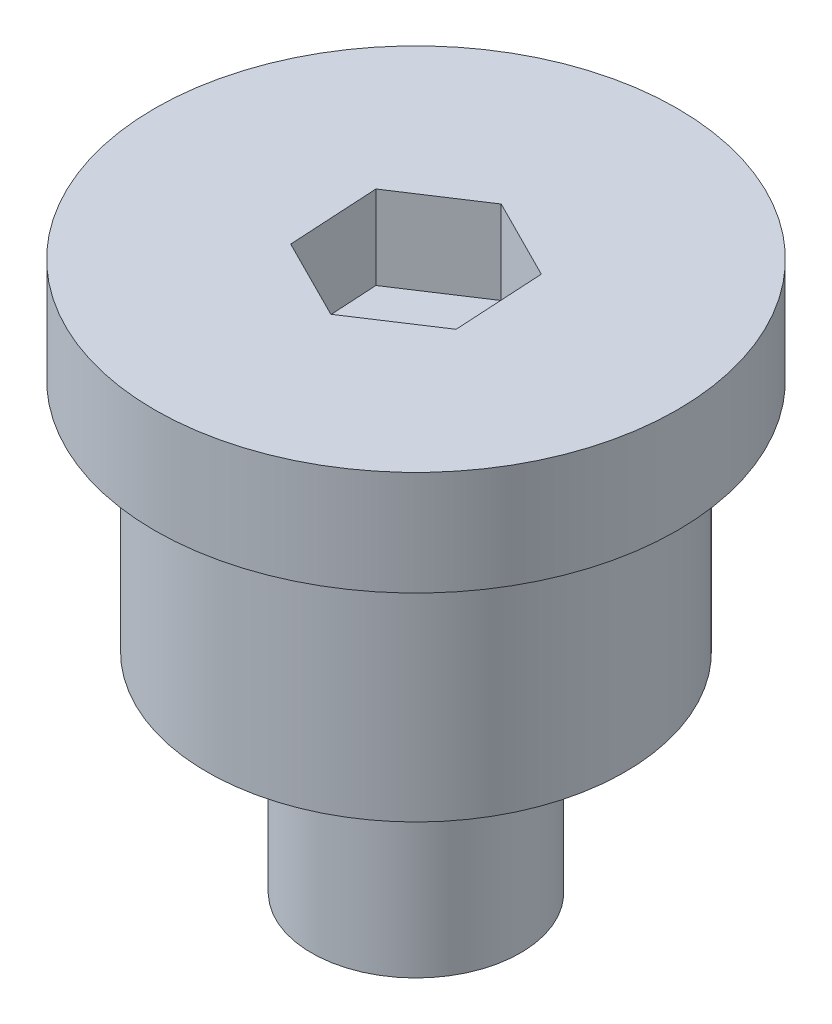
ISO-10303-21;
HEADER;
FILE_DESCRIPTION(('STEP AP214'),'2;1');
FILE_NAME('part.step','',(''),(''),'','','');
FILE_SCHEMA(('AUTOMOTIVE_DESIGN { 1 0 10303 214 1 1 1 1 }'));
ENDSEC;
DATA;
#1=APPLICATION_CONTEXT('core data for automotive mechanical design processes');
#2=APPLICATION_PROTOCOL_DEFINITION('international standard','automotive_design',2000,#1);
#3=PRODUCT_CONTEXT('',#1,'mechanical');
#4=PRODUCT('Part','Part','',(#3));
#5=PRODUCT_RELATED_PRODUCT_CATEGORY('part','',(#4));
#6=PRODUCT_DEFINITION_FORMATION('','',#4);
#7=PRODUCT_DEFINITION_CONTEXT('part definition',#1,'design');
#8=PRODUCT_DEFINITION('design','',#6,#7);
#9=PRODUCT_DEFINITION_SHAPE('','',#8);
#10=(LENGTH_UNIT() NAMED_UNIT(*) SI_UNIT(.MILLI.,.METRE.));
#11=(NAMED_UNIT(*) PLANE_ANGLE_UNIT() SI_UNIT($,.RADIAN.));
#12=(NAMED_UNIT(*) SI_UNIT($,.STERADIAN.) SOLID_ANGLE_UNIT());
#13=UNCERTAINTY_MEASURE_WITH_UNIT(LENGTH_MEASURE(1.E-05),#10,'distance_accuracy_value','');
#14=(GEOMETRIC_REPRESENTATION_CONTEXT(3) GLOBAL_UNCERTAINTY_ASSIGNED_CONTEXT((#13)) GLOBAL_UNIT_ASSIGNED_CONTEXT((#10,
#11,#12)) REPRESENTATION_CONTEXT('',''));
#15=CARTESIAN_POINT('',(0.,0.,0.));
#16=DIRECTION('',(0.,0.,1.));
#17=DIRECTION('',(1.,0.,0.));
#18=AXIS2_PLACEMENT_3D('',#15,#16,#17);
#19=CARTESIAN_POINT('',(0.,0.,3.175));
#20=DIRECTION('',(0.,1.,0.));
#21=DIRECTION('',(0.,0.,1.));
#22=AXIS2_PLACEMENT_3D('',#19,#20,#21);
#23=PLANE('',#22);
#24=CARTESIAN_POINT('',(0.,0.,0.));
#25=DIRECTION('',(0.,-1.,0.));
#26=DIRECTION('',(0.,0.,-1.));
#27=AXIS2_PLACEMENT_3D('',#24,#25,#26);
#28=CIRCLE('',#27,3.175);
#29=CARTESIAN_POINT('',(0.,0.,-3.175));
#30=VERTEX_POINT('',#29);
#31=EDGE_CURVE('E136',#30,#30,#28,.T.);
#32=ORIENTED_EDGE('',*,*,#31,.T.);
#33=EDGE_LOOP('',(#32));
#34=FACE_BOUND('',#33,.T.);
#35=ADVANCED_FACE('F35',(#34),#23,.F.);
#36=CARTESIAN_POINT('',(0.,16.67256,0.));
#37=DIRECTION('',(0.,-1.,0.));
#38=DIRECTION('',(0.,0.,-1.));
#39=AXIS2_PLACEMENT_3D('',#36,#37,#38);
#40=PLANE('',#39);
#41=DIRECTION('',(0.89301324331772,0.,0.4500303848177));
#42=VECTOR('',#41,1.);
#43=CARTESIAN_POINT('',(-2.29936314932081,16.67256,1.50777911430868));
#44=LINE('',#43,#42);
#45=CARTESIAN_POINT('',(-2.29936314932081,16.67256,1.50777911430868));
#46=VERTEX_POINT('',#45);
#47=CARTESIAN_POINT('',(0.156093441626514,16.67256,2.74519645699196));
#48=VERTEX_POINT('',#47);
#49=EDGE_CURVE('E123',#46,#48,#44,.T.);
#50=ORIENTED_EDGE('',*,*,#49,.F.);
#51=DIRECTION('',(0.0567688759318444,0.,0.998387347037929));
#52=VECTOR('',#51,1.);
#53=CARTESIAN_POINT('',(-2.45545659094733,16.67256,-1.23741734268327));
#54=LINE('',#53,#52);
#55=CARTESIAN_POINT('',(-2.45545659094733,16.67256,-1.23741734268327));
#56=VERTEX_POINT('',#55);
#57=EDGE_CURVE('E49',#56,#46,#54,.T.);
#58=ORIENTED_EDGE('',*,*,#57,.F.);
#59=DIRECTION('',(-0.836244367385875,0.,0.548356962220229));
#60=VECTOR('',#59,1.);
#61=CARTESIAN_POINT('',(-0.156093441626515,16.67256,-2.74519645699196));
#62=LINE('',#61,#60);
#63=CARTESIAN_POINT('',(-0.156093441626515,16.67256,-2.74519645699196));
#64=VERTEX_POINT('',#63);
#65=EDGE_CURVE('E132',#64,#56,#62,.T.);
#66=ORIENTED_EDGE('',*,*,#65,.F.);
#67=DIRECTION('',(-0.89301324331772,0.,-0.4500303848177));
#68=VECTOR('',#67,1.);
#69=CARTESIAN_POINT('',(2.29936314932081,16.67256,-1.50777911430869));
#70=LINE('',#69,#68);
#71=CARTESIAN_POINT('',(2.29936314932081,16.67256,-1.50777911430869));
#72=VERTEX_POINT('',#71);
#73=EDGE_CURVE('E130',#72,#64,#70,.T.);
#74=ORIENTED_EDGE('',*,*,#73,.F.);
#75=DIRECTION('',(-0.0567688759318448,0.,-0.998387347037929));
#76=VECTOR('',#75,1.);
#77=CARTESIAN_POINT('',(2.45545659094733,16.67256,1.23741734268327));
#78=LINE('',#77,#76);
#79=CARTESIAN_POINT('',(2.45545659094733,16.67256,1.23741734268327));
#80=VERTEX_POINT('',#79);
#81=EDGE_CURVE('E97',#80,#72,#78,.T.);
#82=ORIENTED_EDGE('',*,*,#81,.F.);
#83=DIRECTION('',(0.836244367385875,0.,-0.54835696222023));
#84=VECTOR('',#83,1.);
#85=CARTESIAN_POINT('',(0.156093441626514,16.67256,2.74519645699196));
#86=LINE('',#85,#84);
#87=EDGE_CURVE('E126',#48,#80,#86,.T.);
#88=ORIENTED_EDGE('',*,*,#87,.F.);
#89=EDGE_LOOP('',(#50,#58,#66,#74,#82,#88));
#90=FACE_BOUND('',#89,.T.);
#91=CARTESIAN_POINT('',(0.,16.67256,0.));
#92=DIRECTION('',(0.,-1.,0.));
#93=DIRECTION('',(0.,0.,-1.));
#94=AXIS2_PLACEMENT_3D('',#91,#92,#93);
#95=CIRCLE('',#94,7.9375);
#96=CARTESIAN_POINT('',(0.,16.67256,-7.9375));
#97=VERTEX_POINT('',#96);
#98=EDGE_CURVE('E11',#97,#97,#95,.T.);
#99=ORIENTED_EDGE('',*,*,#98,.F.);
#100=EDGE_LOOP('',(#99));
#101=FACE_BOUND('',#100,.T.);
#102=ADVANCED_FACE('F160',(#90,#101),#40,.F.);
#103=CARTESIAN_POINT('',(0.,0.,0.));
#104=DIRECTION('',(0.,-1.,0.));
#105=DIRECTION('',(0.,0.,-1.));
#106=AXIS2_PLACEMENT_3D('',#103,#104,#105);
#107=CYLINDRICAL_SURFACE('',#106,7.9375);
#108=CARTESIAN_POINT('',(0.,13.49756,0.));
#109=DIRECTION('',(0.,-1.,0.));
#110=DIRECTION('',(0.,0.,-1.));
#111=AXIS2_PLACEMENT_3D('',#108,#109,#110);
#112=CIRCLE('',#111,7.9375);
#113=CARTESIAN_POINT('',(0.,13.49756,-7.9375));
#114=VERTEX_POINT('',#113);
#115=EDGE_CURVE('E42',#114,#114,#112,.T.);
#116=ORIENTED_EDGE('',*,*,#115,.F.);
#117=EDGE_LOOP('',(#116));
#118=FACE_BOUND('',#117,.T.);
#119=ORIENTED_EDGE('',*,*,#98,.T.);
#120=EDGE_LOOP('',(#119));
#121=FACE_BOUND('',#120,.T.);
#122=ADVANCED_FACE('F157',(#118,#121),#107,.T.);
#123=CARTESIAN_POINT('',(0.,13.49756,7.9375));
#124=DIRECTION('',(0.,1.,0.));
#125=DIRECTION('',(0.,0.,1.));
#126=AXIS2_PLACEMENT_3D('',#123,#124,#125);
#127=PLANE('',#126);
#128=CARTESIAN_POINT('',(0.,13.49756,0.));
#129=DIRECTION('',(0.,-1.,0.));
#130=DIRECTION('',(0.,0.,-1.));
#131=AXIS2_PLACEMENT_3D('',#128,#129,#130);
#132=CIRCLE('',#131,6.35);
#133=CARTESIAN_POINT('',(0.,13.49756,-6.35));
#134=VERTEX_POINT('',#133);
#135=EDGE_CURVE('E150',#134,#134,#132,.T.);
#136=ORIENTED_EDGE('',*,*,#135,.F.);
#137=EDGE_LOOP('',(#136));
#138=FACE_BOUND('',#137,.T.);
#139=ORIENTED_EDGE('',*,*,#115,.T.);
#140=EDGE_LOOP('',(#139));
#141=FACE_BOUND('',#140,.T.);
#142=ADVANCED_FACE('F155',(#138,#141),#127,.F.);
#143=CARTESIAN_POINT('',(0.,0.,0.));
#144=DIRECTION('',(0.,-1.,0.));
#145=DIRECTION('',(0.,0.,-1.));
#146=AXIS2_PLACEMENT_3D('',#143,#144,#145);
#147=CYLINDRICAL_SURFACE('',#146,6.35);
#148=CARTESIAN_POINT('',(0.,6.35,0.));
#149=DIRECTION('',(0.,-1.,0.));
#150=DIRECTION('',(0.,0.,-1.));
#151=AXIS2_PLACEMENT_3D('',#148,#149,#150);
#152=CIRCLE('',#151,6.35);
#153=CARTESIAN_POINT('',(0.,6.35,-6.35));
#154=VERTEX_POINT('',#153);
#155=EDGE_CURVE('E147',#154,#154,#152,.T.);
#156=ORIENTED_EDGE('',*,*,#155,.F.);
#157=EDGE_LOOP('',(#156));
#158=FACE_BOUND('',#157,.T.);
#159=ORIENTED_EDGE('',*,*,#135,.T.);
#160=EDGE_LOOP('',(#159));
#161=FACE_BOUND('',#160,.T.);
#162=ADVANCED_FACE('F174',(#158,#161),#147,.T.);
#163=CARTESIAN_POINT('',(0.,6.35,6.35));
#164=DIRECTION('',(0.,1.,0.));
#165=DIRECTION('',(0.,0.,1.));
#166=AXIS2_PLACEMENT_3D('',#163,#164,#165);
#167=PLANE('',#166);
#168=CARTESIAN_POINT('',(0.,6.35,0.));
#169=DIRECTION('',(0.,-1.,0.));
#170=DIRECTION('',(0.,0.,-1.));
#171=AXIS2_PLACEMENT_3D('',#168,#169,#170);
#172=CIRCLE('',#171,3.175);
#173=CARTESIAN_POINT('',(0.,6.35,-3.175));
#174=VERTEX_POINT('',#173);
#175=EDGE_CURVE('E144',#174,#174,#172,.T.);
#176=ORIENTED_EDGE('',*,*,#175,.F.);
#177=EDGE_LOOP('',(#176));
#178=FACE_BOUND('',#177,.T.);
#179=ORIENTED_EDGE('',*,*,#155,.T.);
#180=EDGE_LOOP('',(#179));
#181=FACE_BOUND('',#180,.T.);
#182=ADVANCED_FACE('F178',(#178,#181),#167,.F.);
#183=CARTESIAN_POINT('',(0.,0.,0.));
#184=DIRECTION('',(0.,-1.,0.));
#185=DIRECTION('',(0.,0.,-1.));
#186=AXIS2_PLACEMENT_3D('',#183,#184,#185);
#187=CYLINDRICAL_SURFACE('',#186,3.175);
#188=ORIENTED_EDGE('',*,*,#31,.F.);
#189=EDGE_LOOP('',(#188));
#190=FACE_BOUND('',#189,.T.);
#191=ORIENTED_EDGE('',*,*,#175,.T.);
#192=EDGE_LOOP('',(#191));
#193=FACE_BOUND('',#192,.T.);
#194=ADVANCED_FACE('F182',(#190,#193),#187,.T.);
#195=CARTESIAN_POINT('',(-2.45545659094733,14.13256,-1.23741734268327));
#196=DIRECTION('',(-0.998387347037929,0.,0.0567688759318444));
#197=DIRECTION('',(0.0567688759318444,0.,0.99838734703793));
#198=AXIS2_PLACEMENT_3D('',#195,#196,#197);
#199=PLANE('',#198);
#200=ORIENTED_EDGE('',*,*,#57,.T.);
#201=DIRECTION('',(0.,1.,0.));
#202=VECTOR('',#201,1.);
#203=CARTESIAN_POINT('',(-2.29936314932081,14.13256,1.50777911430868));
#204=LINE('',#203,#202);
#205=CARTESIAN_POINT('',(-2.29936314932081,14.13256,1.50777911430868));
#206=VERTEX_POINT('',#205);
#207=EDGE_CURVE('E79',#206,#46,#204,.T.);
#208=ORIENTED_EDGE('',*,*,#207,.F.);
#209=DIRECTION('',(0.0567688759318444,0.,0.998387347037929));
#210=VECTOR('',#209,1.);
#211=CARTESIAN_POINT('',(-2.45545659094733,14.13256,-1.23741734268327));
#212=LINE('',#211,#210);
#213=CARTESIAN_POINT('',(-2.45545659094733,14.13256,-1.23741734268327));
#214=VERTEX_POINT('',#213);
#215=EDGE_CURVE('E134',#214,#206,#212,.T.);
#216=ORIENTED_EDGE('',*,*,#215,.F.);
#217=DIRECTION('',(0.,1.,0.));
#218=VECTOR('',#217,1.);
#219=CARTESIAN_POINT('',(-2.45545659094733,14.13256,-1.23741734268327));
#220=LINE('',#219,#218);
#221=EDGE_CURVE('E57',#214,#56,#220,.T.);
#222=ORIENTED_EDGE('',*,*,#221,.T.);
#223=EDGE_LOOP('',(#200,#208,#216,#222));
#224=FACE_BOUND('',#223,.T.);
#225=ADVANCED_FACE('F186',(#224),#199,.F.);
#226=CARTESIAN_POINT('',(-0.156093441626515,14.13256,-2.74519645699196));
#227=DIRECTION('',(-0.548356962220229,0.,-0.836244367385875));
#228=DIRECTION('',(-0.836244367385875,0.,0.548356962220229));
#229=AXIS2_PLACEMENT_3D('',#226,#227,#228);
#230=PLANE('',#229);
#231=ORIENTED_EDGE('',*,*,#65,.T.);
#232=ORIENTED_EDGE('',*,*,#221,.F.);
#233=DIRECTION('',(-0.836244367385875,0.,0.548356962220229));
#234=VECTOR('',#233,1.);
#235=CARTESIAN_POINT('',(-0.156093441626515,14.13256,-2.74519645699196));
#236=LINE('',#235,#234);
#237=CARTESIAN_POINT('',(-0.156093441626515,14.13256,-2.74519645699196));
#238=VERTEX_POINT('',#237);
#239=EDGE_CURVE('E109',#238,#214,#236,.T.);
#240=ORIENTED_EDGE('',*,*,#239,.F.);
#241=DIRECTION('',(0.,1.,0.));
#242=VECTOR('',#241,1.);
#243=CARTESIAN_POINT('',(-0.156093441626515,14.13256,-2.74519645699196));
#244=LINE('',#243,#242);
#245=EDGE_CURVE('E101',#238,#64,#244,.T.);
#246=ORIENTED_EDGE('',*,*,#245,.T.);
#247=EDGE_LOOP('',(#231,#232,#240,#246));
#248=FACE_BOUND('',#247,.T.);
#249=ADVANCED_FACE('F190',(#248),#230,.F.);
#250=CARTESIAN_POINT('',(2.29936314932081,14.13256,-1.50777911430869));
#251=DIRECTION('',(0.4500303848177,0.,-0.89301324331772));
#252=DIRECTION('',(-0.89301324331772,0.,-0.4500303848177));
#253=AXIS2_PLACEMENT_3D('',#250,#251,#252);
#254=PLANE('',#253);
#255=ORIENTED_EDGE('',*,*,#73,.T.);
#256=ORIENTED_EDGE('',*,*,#245,.F.);
#257=DIRECTION('',(-0.89301324331772,0.,-0.4500303848177));
#258=VECTOR('',#257,1.);
#259=CARTESIAN_POINT('',(2.29936314932081,14.13256,-1.50777911430869));
#260=LINE('',#259,#258);
#261=CARTESIAN_POINT('',(2.29936314932081,14.13256,-1.50777911430869));
#262=VERTEX_POINT('',#261);
#263=EDGE_CURVE('E105',#262,#238,#260,.T.);
#264=ORIENTED_EDGE('',*,*,#263,.F.);
#265=DIRECTION('',(0.,1.,0.));
#266=VECTOR('',#265,1.);
#267=CARTESIAN_POINT('',(2.29936314932081,14.13256,-1.50777911430869));
#268=LINE('',#267,#266);
#269=EDGE_CURVE('E90',#262,#72,#268,.T.);
#270=ORIENTED_EDGE('',*,*,#269,.T.);
#271=EDGE_LOOP('',(#255,#256,#264,#270));
#272=FACE_BOUND('',#271,.T.);
#273=ADVANCED_FACE('F106',(#272),#254,.F.);
#274=CARTESIAN_POINT('',(2.45545659094733,14.13256,1.23741734268327));
#275=DIRECTION('',(0.998387347037929,0.,-0.0567688759318448));
#276=DIRECTION('',(-0.0567688759318449,0.,-0.99838734703793));
#277=AXIS2_PLACEMENT_3D('',#274,#275,#276);
#278=PLANE('',#277);
#279=ORIENTED_EDGE('',*,*,#81,.T.);
#280=ORIENTED_EDGE('',*,*,#269,.F.);
#281=DIRECTION('',(-0.0567688759318448,0.,-0.998387347037929));
#282=VECTOR('',#281,1.);
#283=CARTESIAN_POINT('',(2.45545659094733,14.13256,1.23741734268327));
#284=LINE('',#283,#282);
#285=CARTESIAN_POINT('',(2.45545659094733,14.13256,1.23741734268327));
#286=VERTEX_POINT('',#285);
#287=EDGE_CURVE('E94',#286,#262,#284,.T.);
#288=ORIENTED_EDGE('',*,*,#287,.F.);
#289=DIRECTION('',(0.,1.,0.));
#290=VECTOR('',#289,1.);
#291=CARTESIAN_POINT('',(2.45545659094733,14.13256,1.23741734268327));
#292=LINE('',#291,#290);
#293=EDGE_CURVE('E102',#286,#80,#292,.T.);
#294=ORIENTED_EDGE('',*,*,#293,.T.);
#295=EDGE_LOOP('',(#279,#280,#288,#294));
#296=FACE_BOUND('',#295,.T.);
#297=ADVANCED_FACE('F92',(#296),#278,.F.);
#298=CARTESIAN_POINT('',(0.156093441626514,14.13256,2.74519645699196));
#299=DIRECTION('',(0.548356962220229,0.,0.836244367385875));
#300=DIRECTION('',(0.836244367385875,0.,-0.54835696222023));
#301=AXIS2_PLACEMENT_3D('',#298,#299,#300);
#302=PLANE('',#301);
#303=ORIENTED_EDGE('',*,*,#87,.T.);
#304=ORIENTED_EDGE('',*,*,#293,.F.);
#305=DIRECTION('',(0.836244367385875,0.,-0.54835696222023));
#306=VECTOR('',#305,1.);
#307=CARTESIAN_POINT('',(0.156093441626514,14.13256,2.74519645699196));
#308=LINE('',#307,#306);
#309=CARTESIAN_POINT('',(0.156093441626514,14.13256,2.74519645699196));
#310=VERTEX_POINT('',#309);
#311=EDGE_CURVE('E115',#310,#286,#308,.T.);
#312=ORIENTED_EDGE('',*,*,#311,.F.);
#313=DIRECTION('',(0.,1.,0.));
#314=VECTOR('',#313,1.);
#315=CARTESIAN_POINT('',(0.156093441626514,14.13256,2.74519645699196));
#316=LINE('',#315,#314);
#317=EDGE_CURVE('E139',#310,#48,#316,.T.);
#318=ORIENTED_EDGE('',*,*,#317,.T.);
#319=EDGE_LOOP('',(#303,#304,#312,#318));
#320=FACE_BOUND('',#319,.T.);
#321=ADVANCED_FACE('F194',(#320),#302,.F.);
#322=CARTESIAN_POINT('',(-2.29936314932081,14.13256,1.50777911430868));
#323=DIRECTION('',(-0.4500303848177,0.,0.89301324331772));
#324=DIRECTION('',(0.89301324331772,0.,0.4500303848177));
#325=AXIS2_PLACEMENT_3D('',#322,#323,#324);
#326=PLANE('',#325);
#327=ORIENTED_EDGE('',*,*,#49,.T.);
#328=ORIENTED_EDGE('',*,*,#317,.F.);
#329=DIRECTION('',(0.89301324331772,0.,0.4500303848177));
#330=VECTOR('',#329,1.);
#331=CARTESIAN_POINT('',(-2.29936314932081,14.13256,1.50777911430868));
#332=LINE('',#331,#330);
#333=EDGE_CURVE('E117',#206,#310,#332,.T.);
#334=ORIENTED_EDGE('',*,*,#333,.F.);
#335=ORIENTED_EDGE('',*,*,#207,.T.);
#336=EDGE_LOOP('',(#327,#328,#334,#335));
#337=FACE_BOUND('',#336,.T.);
#338=ADVANCED_FACE('F191',(#337),#326,.F.);
#339=CARTESIAN_POINT('',(0.,14.13256,0.));
#340=DIRECTION('',(0.,1.,0.));
#341=DIRECTION('',(0.,0.,1.));
#342=AXIS2_PLACEMENT_3D('',#339,#340,#341);
#343=PLANE('',#342);
#344=ORIENTED_EDGE('',*,*,#215,.T.);
#345=ORIENTED_EDGE('',*,*,#333,.T.);
#346=ORIENTED_EDGE('',*,*,#311,.T.);
#347=ORIENTED_EDGE('',*,*,#287,.T.);
#348=ORIENTED_EDGE('',*,*,#263,.T.);
#349=ORIENTED_EDGE('',*,*,#239,.T.);
#350=EDGE_LOOP('',(#344,#345,#346,#347,#348,#349));
#351=FACE_BOUND('',#350,.T.);
#352=ADVANCED_FACE('F112',(#351),#343,.T.);
#353=CLOSED_SHELL('',(#35,#102,#122,#142,#162,#182,#194,#225,#249,#273,#297,#321,#338,#352));
#354=MANIFOLD_SOLID_BREP('B2',#353);
#355=ADVANCED_BREP_SHAPE_REPRESENTATION('',(#18,#354),#14);
#356=SHAPE_DEFINITION_REPRESENTATION(#9,#355);
ENDSEC;
END-ISO-10303-21;
